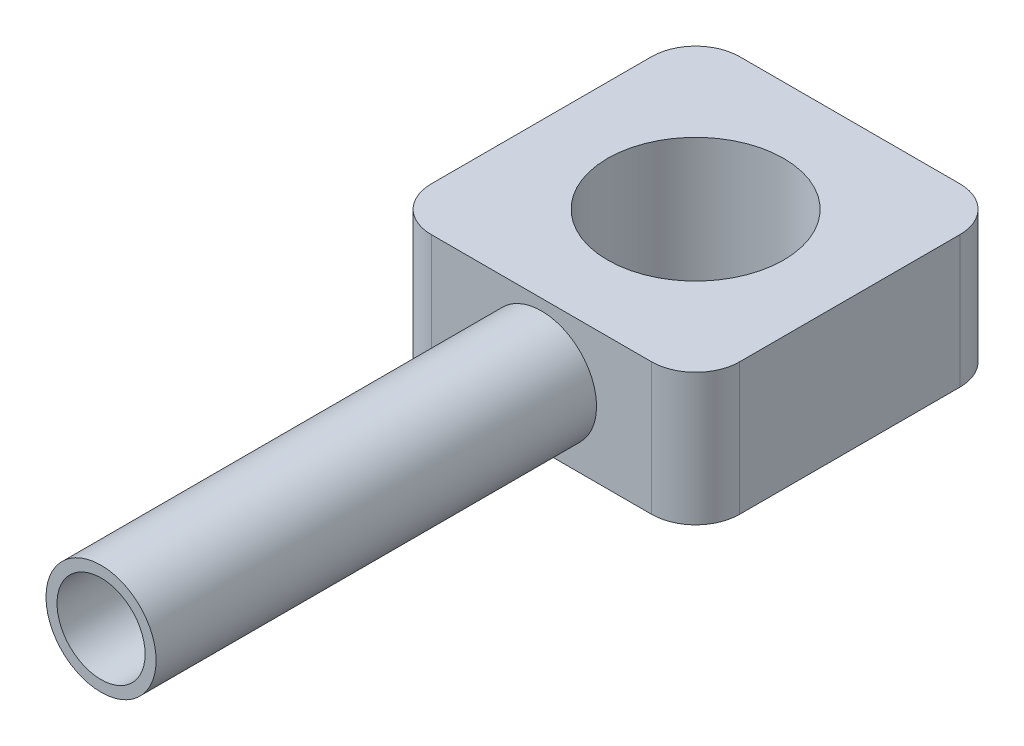
ISO-10303-21;
HEADER;
FILE_DESCRIPTION(('STEP AP214'),'2;1');
FILE_NAME('part.step','',(''),(''),'','','');
FILE_SCHEMA(('AUTOMOTIVE_DESIGN { 1 0 10303 214 1 1 1 1 }'));
ENDSEC;
DATA;
#1=APPLICATION_CONTEXT('core data for automotive mechanical design processes');
#2=APPLICATION_PROTOCOL_DEFINITION('international standard','automotive_design',2000,#1);
#3=PRODUCT_CONTEXT('',#1,'mechanical');
#4=PRODUCT('Part','Part','',(#3));
#5=PRODUCT_RELATED_PRODUCT_CATEGORY('part','',(#4));
#6=PRODUCT_DEFINITION_FORMATION('','',#4);
#7=PRODUCT_DEFINITION_CONTEXT('part definition',#1,'design');
#8=PRODUCT_DEFINITION('design','',#6,#7);
#9=PRODUCT_DEFINITION_SHAPE('','',#8);
#10=(LENGTH_UNIT() NAMED_UNIT(*) SI_UNIT(.MILLI.,.METRE.));
#11=(NAMED_UNIT(*) PLANE_ANGLE_UNIT() SI_UNIT($,.RADIAN.));
#12=(NAMED_UNIT(*) SI_UNIT($,.STERADIAN.) SOLID_ANGLE_UNIT());
#13=UNCERTAINTY_MEASURE_WITH_UNIT(LENGTH_MEASURE(1.E-05),#10,'distance_accuracy_value','');
#14=(GEOMETRIC_REPRESENTATION_CONTEXT(3) GLOBAL_UNCERTAINTY_ASSIGNED_CONTEXT((#13)) GLOBAL_UNIT_ASSIGNED_CONTEXT((#10,
#11,#12)) REPRESENTATION_CONTEXT('',''));
#15=CARTESIAN_POINT('',(0.,0.,0.));
#16=DIRECTION('',(0.,0.,1.));
#17=DIRECTION('',(1.,0.,0.));
#18=AXIS2_PLACEMENT_3D('',#15,#16,#17);
#19=CARTESIAN_POINT('',(-125.,150.,125.));
#20=DIRECTION('',(0.,-1.,0.));
#21=DIRECTION('',(0.,0.,-1.));
#22=AXIS2_PLACEMENT_3D('',#19,#20,#21);
#23=PLANE('',#22);
#24=CARTESIAN_POINT('',(-125.,150.,125.));
#25=DIRECTION('',(0.,1.,0.));
#26=DIRECTION('',(0.,0.,-1.));
#27=AXIS2_PLACEMENT_3D('',#24,#25,#26);
#28=CIRCLE('',#27,50.);
#29=CARTESIAN_POINT('',(-175.,150.,125.));
#30=VERTEX_POINT('',#29);
#31=CARTESIAN_POINT('',(-125.,150.,175.));
#32=VERTEX_POINT('',#31);
#33=EDGE_CURVE('E152',#30,#32,#28,.T.);
#34=ORIENTED_EDGE('',*,*,#33,.T.);
#35=DIRECTION('',(1.,0.,0.));
#36=VECTOR('',#35,1.);
#37=CARTESIAN_POINT('',(-125.,150.,175.));
#38=LINE('',#37,#36);
#39=CARTESIAN_POINT('',(125.,150.,175.));
#40=VERTEX_POINT('',#39);
#41=EDGE_CURVE('E100',#32,#40,#38,.T.);
#42=ORIENTED_EDGE('',*,*,#41,.T.);
#43=CARTESIAN_POINT('',(125.,150.,125.));
#44=DIRECTION('',(0.,1.,0.));
#45=DIRECTION('',(0.,0.,1.));
#46=AXIS2_PLACEMENT_3D('',#43,#44,#45);
#47=CIRCLE('',#46,50.);
#48=CARTESIAN_POINT('',(175.,150.,125.));
#49=VERTEX_POINT('',#48);
#50=EDGE_CURVE('E184',#40,#49,#47,.T.);
#51=ORIENTED_EDGE('',*,*,#50,.T.);
#52=DIRECTION('',(0.,0.,-1.));
#53=VECTOR('',#52,1.);
#54=CARTESIAN_POINT('',(175.,150.,-125.));
#55=LINE('',#54,#53);
#56=CARTESIAN_POINT('',(175.,150.,-125.));
#57=VERTEX_POINT('',#56);
#58=EDGE_CURVE('E183',#49,#57,#55,.T.);
#59=ORIENTED_EDGE('',*,*,#58,.T.);
#60=CARTESIAN_POINT('',(125.,150.,-125.));
#61=DIRECTION('',(0.,1.,0.));
#62=DIRECTION('',(0.,0.,-1.));
#63=AXIS2_PLACEMENT_3D('',#60,#61,#62);
#64=CIRCLE('',#63,50.);
#65=CARTESIAN_POINT('',(125.,150.,-175.));
#66=VERTEX_POINT('',#65);
#67=EDGE_CURVE('E119',#57,#66,#64,.T.);
#68=ORIENTED_EDGE('',*,*,#67,.T.);
#69=DIRECTION('',(-1.,0.,0.));
#70=VECTOR('',#69,1.);
#71=CARTESIAN_POINT('',(-125.,150.,-175.));
#72=LINE('',#71,#70);
#73=CARTESIAN_POINT('',(-125.,150.,-175.));
#74=VERTEX_POINT('',#73);
#75=EDGE_CURVE('E113',#66,#74,#72,.T.);
#76=ORIENTED_EDGE('',*,*,#75,.T.);
#77=CARTESIAN_POINT('',(-125.,150.,-125.));
#78=DIRECTION('',(0.,1.,0.));
#79=DIRECTION('',(0.,0.,1.));
#80=AXIS2_PLACEMENT_3D('',#77,#78,#79);
#81=CIRCLE('',#80,50.);
#82=CARTESIAN_POINT('',(-175.,150.,-125.));
#83=VERTEX_POINT('',#82);
#84=EDGE_CURVE('E117',#74,#83,#81,.T.);
#85=ORIENTED_EDGE('',*,*,#84,.T.);
#86=DIRECTION('',(0.,0.,1.));
#87=VECTOR('',#86,1.);
#88=CARTESIAN_POINT('',(-175.,150.,-125.));
#89=LINE('',#88,#87);
#90=EDGE_CURVE('E56',#83,#30,#89,.T.);
#91=ORIENTED_EDGE('',*,*,#90,.T.);
#92=EDGE_LOOP('',(#34,#42,#51,#59,#68,#76,#85,#91));
#93=FACE_BOUND('',#92,.T.);
#94=CARTESIAN_POINT('',(0.,150.,0.));
#95=DIRECTION('',(0.,1.,0.));
#96=DIRECTION('',(0.,0.,1.));
#97=AXIS2_PLACEMENT_3D('',#94,#95,#96);
#98=CIRCLE('',#97,100.);
#99=CARTESIAN_POINT('',(0.,150.,100.));
#100=VERTEX_POINT('',#99);
#101=EDGE_CURVE('E141',#100,#100,#98,.T.);
#102=ORIENTED_EDGE('',*,*,#101,.F.);
#103=EDGE_LOOP('',(#102));
#104=FACE_BOUND('',#103,.T.);
#105=ADVANCED_FACE('F39',(#93,#104),#23,.F.);
#106=CARTESIAN_POINT('',(-125.,0.,125.));
#107=DIRECTION('',(0.,-1.,0.));
#108=DIRECTION('',(0.,0.,-1.));
#109=AXIS2_PLACEMENT_3D('',#106,#107,#108);
#110=PLANE('',#109);
#111=CARTESIAN_POINT('',(-125.,0.,125.));
#112=DIRECTION('',(0.,1.,0.));
#113=DIRECTION('',(0.,0.,-1.));
#114=AXIS2_PLACEMENT_3D('',#111,#112,#113);
#115=CIRCLE('',#114,50.);
#116=CARTESIAN_POINT('',(-175.,0.,125.));
#117=VERTEX_POINT('',#116);
#118=CARTESIAN_POINT('',(-125.,0.,175.));
#119=VERTEX_POINT('',#118);
#120=EDGE_CURVE('E137',#117,#119,#115,.T.);
#121=ORIENTED_EDGE('',*,*,#120,.F.);
#122=DIRECTION('',(0.,0.,1.));
#123=VECTOR('',#122,1.);
#124=CARTESIAN_POINT('',(-175.,0.,-125.));
#125=LINE('',#124,#123);
#126=CARTESIAN_POINT('',(-175.,0.,-125.));
#127=VERTEX_POINT('',#126);
#128=EDGE_CURVE('E91',#127,#117,#125,.T.);
#129=ORIENTED_EDGE('',*,*,#128,.F.);
#130=CARTESIAN_POINT('',(-125.,0.,-125.));
#131=DIRECTION('',(0.,1.,0.));
#132=DIRECTION('',(0.,0.,1.));
#133=AXIS2_PLACEMENT_3D('',#130,#131,#132);
#134=CIRCLE('',#133,50.);
#135=CARTESIAN_POINT('',(-125.,0.,-175.));
#136=VERTEX_POINT('',#135);
#137=EDGE_CURVE('E85',#136,#127,#134,.T.);
#138=ORIENTED_EDGE('',*,*,#137,.F.);
#139=DIRECTION('',(-1.,0.,0.));
#140=VECTOR('',#139,1.);
#141=CARTESIAN_POINT('',(-125.,0.,-175.));
#142=LINE('',#141,#140);
#143=CARTESIAN_POINT('',(125.,0.,-175.));
#144=VERTEX_POINT('',#143);
#145=EDGE_CURVE('E127',#144,#136,#142,.T.);
#146=ORIENTED_EDGE('',*,*,#145,.F.);
#147=CARTESIAN_POINT('',(125.,0.,-125.));
#148=DIRECTION('',(0.,1.,0.));
#149=DIRECTION('',(0.,0.,-1.));
#150=AXIS2_PLACEMENT_3D('',#147,#148,#149);
#151=CIRCLE('',#150,50.);
#152=CARTESIAN_POINT('',(175.,0.,-125.));
#153=VERTEX_POINT('',#152);
#154=EDGE_CURVE('E147',#153,#144,#151,.T.);
#155=ORIENTED_EDGE('',*,*,#154,.F.);
#156=DIRECTION('',(0.,0.,-1.));
#157=VECTOR('',#156,1.);
#158=CARTESIAN_POINT('',(175.,0.,-125.));
#159=LINE('',#158,#157);
#160=CARTESIAN_POINT('',(175.,0.,125.));
#161=VERTEX_POINT('',#160);
#162=EDGE_CURVE('E145',#161,#153,#159,.T.);
#163=ORIENTED_EDGE('',*,*,#162,.F.);
#164=CARTESIAN_POINT('',(125.,0.,125.));
#165=DIRECTION('',(0.,1.,0.));
#166=DIRECTION('',(0.,0.,1.));
#167=AXIS2_PLACEMENT_3D('',#164,#165,#166);
#168=CIRCLE('',#167,50.);
#169=CARTESIAN_POINT('',(125.,0.,175.));
#170=VERTEX_POINT('',#169);
#171=EDGE_CURVE('E143',#170,#161,#168,.T.);
#172=ORIENTED_EDGE('',*,*,#171,.F.);
#173=DIRECTION('',(1.,0.,0.));
#174=VECTOR('',#173,1.);
#175=CARTESIAN_POINT('',(-125.,0.,175.));
#176=LINE('',#175,#174);
#177=EDGE_CURVE('E140',#119,#170,#176,.T.);
#178=ORIENTED_EDGE('',*,*,#177,.F.);
#179=EDGE_LOOP('',(#121,#129,#138,#146,#155,#163,#172,#178));
#180=FACE_BOUND('',#179,.T.);
#181=CARTESIAN_POINT('',(0.,0.,0.));
#182=DIRECTION('',(0.,1.,0.));
#183=DIRECTION('',(0.,0.,1.));
#184=AXIS2_PLACEMENT_3D('',#181,#182,#183);
#185=CIRCLE('',#184,100.);
#186=CARTESIAN_POINT('',(0.,0.,100.));
#187=VERTEX_POINT('',#186);
#188=EDGE_CURVE('E190',#187,#187,#185,.T.);
#189=ORIENTED_EDGE('',*,*,#188,.T.);
#190=EDGE_LOOP('',(#189));
#191=FACE_BOUND('',#190,.T.);
#192=ADVANCED_FACE('F170',(#180,#191),#110,.T.);
#193=CARTESIAN_POINT('',(-125.,150.,125.));
#194=DIRECTION('',(0.,-1.,0.));
#195=DIRECTION('',(0.,0.,-1.));
#196=AXIS2_PLACEMENT_3D('',#193,#194,#195);
#197=CYLINDRICAL_SURFACE('',#196,50.);
#198=ORIENTED_EDGE('',*,*,#120,.T.);
#199=DIRECTION('',(0.,-1.,0.));
#200=VECTOR('',#199,1.);
#201=CARTESIAN_POINT('',(-125.,150.,175.));
#202=LINE('',#201,#200);
#203=EDGE_CURVE('E48',#32,#119,#202,.T.);
#204=ORIENTED_EDGE('',*,*,#203,.F.);
#205=ORIENTED_EDGE('',*,*,#33,.F.);
#206=DIRECTION('',(0.,-1.,0.));
#207=VECTOR('',#206,1.);
#208=CARTESIAN_POINT('',(-175.,150.,125.));
#209=LINE('',#208,#207);
#210=EDGE_CURVE('E133',#30,#117,#209,.T.);
#211=ORIENTED_EDGE('',*,*,#210,.T.);
#212=EDGE_LOOP('',(#198,#204,#205,#211));
#213=FACE_BOUND('',#212,.T.);
#214=ADVANCED_FACE('F41',(#213),#197,.T.);
#215=CARTESIAN_POINT('',(-125.,150.,175.));
#216=DIRECTION('',(0.,0.,-1.));
#217=DIRECTION('',(-1.,0.,0.));
#218=AXIS2_PLACEMENT_3D('',#215,#216,#217);
#219=PLANE('',#218);
#220=CARTESIAN_POINT('',(0.,75.,175.));
#221=DIRECTION('',(0.,0.,-1.));
#222=DIRECTION('',(-1.,0.,0.));
#223=AXIS2_PLACEMENT_3D('',#220,#221,#222);
#224=CIRCLE('',#223,62.5);
#225=CARTESIAN_POINT('',(-62.5,75.,175.));
#226=VERTEX_POINT('',#225);
#227=EDGE_CURVE('E11',#226,#226,#224,.F.);
#228=ORIENTED_EDGE('',*,*,#227,.F.);
#229=EDGE_LOOP('',(#228));
#230=FACE_BOUND('',#229,.T.);
#231=ORIENTED_EDGE('',*,*,#177,.T.);
#232=DIRECTION('',(0.,-1.,0.));
#233=VECTOR('',#232,1.);
#234=CARTESIAN_POINT('',(125.,150.,175.));
#235=LINE('',#234,#233);
#236=EDGE_CURVE('E162',#40,#170,#235,.T.);
#237=ORIENTED_EDGE('',*,*,#236,.F.);
#238=ORIENTED_EDGE('',*,*,#41,.F.);
#239=ORIENTED_EDGE('',*,*,#203,.T.);
#240=EDGE_LOOP('',(#231,#237,#238,#239));
#241=FACE_BOUND('',#240,.T.);
#242=ADVANCED_FACE('F165',(#230,#241),#219,.F.);
#243=CARTESIAN_POINT('',(125.,150.,125.));
#244=DIRECTION('',(0.,-1.,0.));
#245=DIRECTION('',(0.,0.,-1.));
#246=AXIS2_PLACEMENT_3D('',#243,#244,#245);
#247=CYLINDRICAL_SURFACE('',#246,50.);
#248=ORIENTED_EDGE('',*,*,#171,.T.);
#249=DIRECTION('',(0.,-1.,0.));
#250=VECTOR('',#249,1.);
#251=CARTESIAN_POINT('',(175.,150.,125.));
#252=LINE('',#251,#250);
#253=EDGE_CURVE('E159',#49,#161,#252,.T.);
#254=ORIENTED_EDGE('',*,*,#253,.F.);
#255=ORIENTED_EDGE('',*,*,#50,.F.);
#256=ORIENTED_EDGE('',*,*,#236,.T.);
#257=EDGE_LOOP('',(#248,#254,#255,#256));
#258=FACE_BOUND('',#257,.T.);
#259=ADVANCED_FACE('F177',(#258),#247,.T.);
#260=CARTESIAN_POINT('',(175.,150.,-125.));
#261=DIRECTION('',(-1.,0.,0.));
#262=DIRECTION('',(0.,0.,1.));
#263=AXIS2_PLACEMENT_3D('',#260,#261,#262);
#264=PLANE('',#263);
#265=ORIENTED_EDGE('',*,*,#162,.T.);
#266=DIRECTION('',(0.,-1.,0.));
#267=VECTOR('',#266,1.);
#268=CARTESIAN_POINT('',(175.,150.,-125.));
#269=LINE('',#268,#267);
#270=EDGE_CURVE('E156',#57,#153,#269,.T.);
#271=ORIENTED_EDGE('',*,*,#270,.F.);
#272=ORIENTED_EDGE('',*,*,#58,.F.);
#273=ORIENTED_EDGE('',*,*,#253,.T.);
#274=EDGE_LOOP('',(#265,#271,#272,#273));
#275=FACE_BOUND('',#274,.T.);
#276=ADVANCED_FACE('F181',(#275),#264,.F.);
#277=CARTESIAN_POINT('',(125.,150.,-125.));
#278=DIRECTION('',(0.,-1.,0.));
#279=DIRECTION('',(0.,0.,-1.));
#280=AXIS2_PLACEMENT_3D('',#277,#278,#279);
#281=CYLINDRICAL_SURFACE('',#280,50.);
#282=ORIENTED_EDGE('',*,*,#154,.T.);
#283=DIRECTION('',(0.,-1.,0.));
#284=VECTOR('',#283,1.);
#285=CARTESIAN_POINT('',(125.,150.,-175.));
#286=LINE('',#285,#284);
#287=EDGE_CURVE('E128',#66,#144,#286,.T.);
#288=ORIENTED_EDGE('',*,*,#287,.F.);
#289=ORIENTED_EDGE('',*,*,#67,.F.);
#290=ORIENTED_EDGE('',*,*,#270,.T.);
#291=EDGE_LOOP('',(#282,#288,#289,#290));
#292=FACE_BOUND('',#291,.T.);
#293=ADVANCED_FACE('F238',(#292),#281,.T.);
#294=CARTESIAN_POINT('',(-125.,150.,-175.));
#295=DIRECTION('',(0.,0.,1.));
#296=DIRECTION('',(1.,0.,0.));
#297=AXIS2_PLACEMENT_3D('',#294,#295,#296);
#298=PLANE('',#297);
#299=ORIENTED_EDGE('',*,*,#145,.T.);
#300=DIRECTION('',(0.,-1.,0.));
#301=VECTOR('',#300,1.);
#302=CARTESIAN_POINT('',(-125.,150.,-175.));
#303=LINE('',#302,#301);
#304=EDGE_CURVE('E124',#74,#136,#303,.T.);
#305=ORIENTED_EDGE('',*,*,#304,.F.);
#306=ORIENTED_EDGE('',*,*,#75,.F.);
#307=ORIENTED_EDGE('',*,*,#287,.T.);
#308=EDGE_LOOP('',(#299,#305,#306,#307));
#309=FACE_BOUND('',#308,.T.);
#310=ADVANCED_FACE('F125',(#309),#298,.F.);
#311=CARTESIAN_POINT('',(-125.,150.,-125.));
#312=DIRECTION('',(0.,-1.,0.));
#313=DIRECTION('',(0.,0.,-1.));
#314=AXIS2_PLACEMENT_3D('',#311,#312,#313);
#315=CYLINDRICAL_SURFACE('',#314,50.);
#316=ORIENTED_EDGE('',*,*,#137,.T.);
#317=DIRECTION('',(0.,-1.,0.));
#318=VECTOR('',#317,1.);
#319=CARTESIAN_POINT('',(-175.,150.,-125.));
#320=LINE('',#319,#318);
#321=EDGE_CURVE('E129',#83,#127,#320,.T.);
#322=ORIENTED_EDGE('',*,*,#321,.F.);
#323=ORIENTED_EDGE('',*,*,#84,.F.);
#324=ORIENTED_EDGE('',*,*,#304,.T.);
#325=EDGE_LOOP('',(#316,#322,#323,#324));
#326=FACE_BOUND('',#325,.T.);
#327=ADVANCED_FACE('F131',(#326),#315,.T.);
#328=CARTESIAN_POINT('',(-175.,150.,-125.));
#329=DIRECTION('',(1.,0.,0.));
#330=DIRECTION('',(0.,0.,-1.));
#331=AXIS2_PLACEMENT_3D('',#328,#329,#330);
#332=PLANE('',#331);
#333=ORIENTED_EDGE('',*,*,#128,.T.);
#334=ORIENTED_EDGE('',*,*,#210,.F.);
#335=ORIENTED_EDGE('',*,*,#90,.F.);
#336=ORIENTED_EDGE('',*,*,#321,.T.);
#337=EDGE_LOOP('',(#333,#334,#335,#336));
#338=FACE_BOUND('',#337,.T.);
#339=ADVANCED_FACE('F221',(#338),#332,.F.);
#340=CARTESIAN_POINT('',(0.,150.,0.));
#341=DIRECTION('',(0.,-1.,0.));
#342=DIRECTION('',(0.,0.,-1.));
#343=AXIS2_PLACEMENT_3D('',#340,#341,#342);
#344=CYLINDRICAL_SURFACE('',#343,100.);
#345=ORIENTED_EDGE('',*,*,#101,.T.);
#346=EDGE_LOOP('',(#345));
#347=FACE_BOUND('',#346,.T.);
#348=ORIENTED_EDGE('',*,*,#188,.F.);
#349=EDGE_LOOP('',(#348));
#350=FACE_BOUND('',#349,.T.);
#351=ADVANCED_FACE('F211',(#347,#350),#344,.F.);
#352=CARTESIAN_POINT('',(0.,75.,675.));
#353=DIRECTION('',(0.,0.,1.));
#354=DIRECTION('',(1.,0.,0.));
#355=AXIS2_PLACEMENT_3D('',#352,#353,#354);
#356=PLANE('',#355);
#357=CARTESIAN_POINT('',(0.,75.,675.));
#358=DIRECTION('',(0.,0.,1.));
#359=DIRECTION('',(1.,0.,0.));
#360=AXIS2_PLACEMENT_3D('',#357,#358,#359);
#361=CIRCLE('',#360,62.5);
#362=CARTESIAN_POINT('',(62.5,75.,675.));
#363=VERTEX_POINT('',#362);
#364=EDGE_CURVE('E193',#363,#363,#361,.T.);
#365=ORIENTED_EDGE('',*,*,#364,.T.);
#366=EDGE_LOOP('',(#365));
#367=FACE_BOUND('',#366,.T.);
#368=CARTESIAN_POINT('',(0.,75.,675.));
#369=DIRECTION('',(0.,0.,1.));
#370=DIRECTION('',(1.,0.,0.));
#371=AXIS2_PLACEMENT_3D('',#368,#369,#370);
#372=CIRCLE('',#371,50.);
#373=CARTESIAN_POINT('',(50.,75.,675.));
#374=VERTEX_POINT('',#373);
#375=EDGE_CURVE('E198',#374,#374,#372,.T.);
#376=ORIENTED_EDGE('',*,*,#375,.F.);
#377=EDGE_LOOP('',(#376));
#378=FACE_BOUND('',#377,.T.);
#379=ADVANCED_FACE('F208',(#367,#378),#356,.T.);
#380=CARTESIAN_POINT('',(0.,75.,675.));
#381=DIRECTION('',(0.,0.,-1.));
#382=DIRECTION('',(-1.,0.,0.));
#383=AXIS2_PLACEMENT_3D('',#380,#381,#382);
#384=CYLINDRICAL_SURFACE('',#383,62.5);
#385=ORIENTED_EDGE('',*,*,#364,.F.);
#386=EDGE_LOOP('',(#385));
#387=FACE_BOUND('',#386,.T.);
#388=ORIENTED_EDGE('',*,*,#227,.T.);
#389=EDGE_LOOP('',(#388));
#390=FACE_BOUND('',#389,.T.);
#391=ADVANCED_FACE('F210',(#387,#390),#384,.T.);
#392=CARTESIAN_POINT('',(0.,75.,675.));
#393=DIRECTION('',(0.,0.,-1.));
#394=DIRECTION('',(-1.,0.,0.));
#395=AXIS2_PLACEMENT_3D('',#392,#393,#394);
#396=CYLINDRICAL_SURFACE('',#395,50.);
#397=ORIENTED_EDGE('',*,*,#375,.T.);
#398=EDGE_LOOP('',(#397));
#399=FACE_BOUND('',#398,.T.);
#400=CARTESIAN_POINT('',(0.,75.,175.));
#401=DIRECTION('',(0.,0.,1.));
#402=DIRECTION('',(1.,0.,0.));
#403=AXIS2_PLACEMENT_3D('',#400,#401,#402);
#404=CIRCLE('',#403,50.);
#405=CARTESIAN_POINT('',(50.,75.,175.));
#406=VERTEX_POINT('',#405);
#407=EDGE_CURVE('E199',#406,#406,#404,.T.);
#408=ORIENTED_EDGE('',*,*,#407,.F.);
#409=EDGE_LOOP('',(#408));
#410=FACE_BOUND('',#409,.T.);
#411=ADVANCED_FACE('F205',(#399,#410),#396,.F.);
#412=ORIENTED_EDGE('',*,*,#407,.T.);
#413=EDGE_LOOP('',(#412));
#414=FACE_BOUND('',#413,.T.);
#415=ADVANCED_FACE('F246',(#414),#219,.F.);
#416=CLOSED_SHELL('',(#105,#192,#214,#242,#259,#276,#293,#310,#327,#339,#351,#379,#391,#411,#415));
#417=MANIFOLD_SOLID_BREP('B2',#416);
#418=ADVANCED_BREP_SHAPE_REPRESENTATION('',(#18,#417),#14);
#419=SHAPE_DEFINITION_REPRESENTATION(#9,#418);
ENDSEC;
END-ISO-10303-21;
